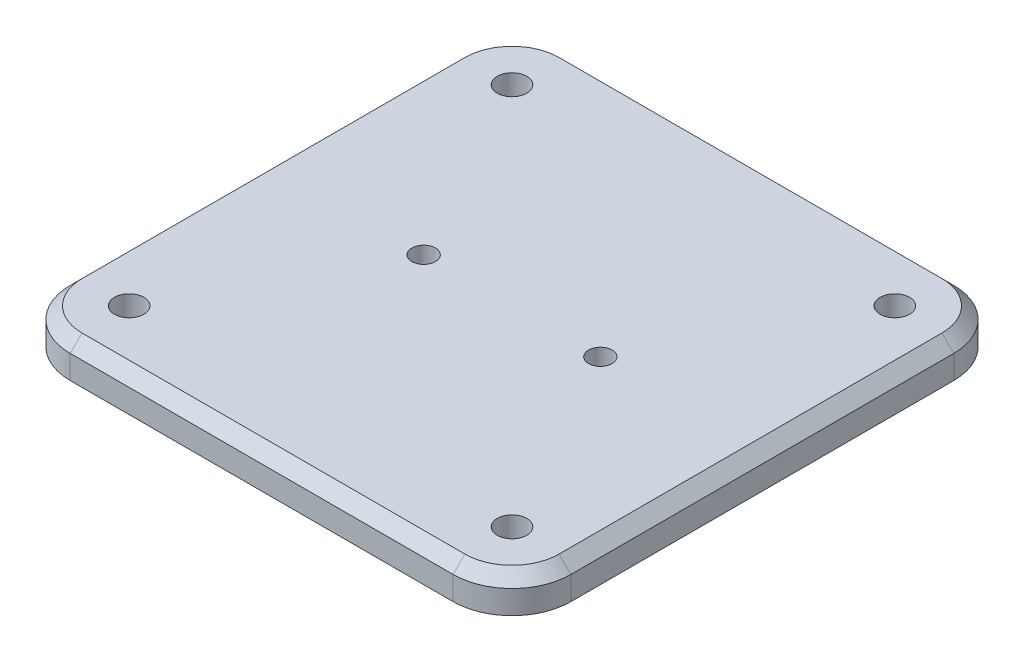
ISO-10303-21;
HEADER;
FILE_DESCRIPTION(('STEP AP214'),'2;1');
FILE_NAME('part.step','',(''),(''),'','','');
FILE_SCHEMA(('AUTOMOTIVE_DESIGN { 1 0 10303 214 1 1 1 1 }'));
ENDSEC;
DATA;
#1=APPLICATION_CONTEXT('core data for automotive mechanical design processes');
#2=APPLICATION_PROTOCOL_DEFINITION('international standard','automotive_design',2000,#1);
#3=PRODUCT_CONTEXT('',#1,'mechanical');
#4=PRODUCT('Part','Part','',(#3));
#5=PRODUCT_RELATED_PRODUCT_CATEGORY('part','',(#4));
#6=PRODUCT_DEFINITION_FORMATION('','',#4);
#7=PRODUCT_DEFINITION_CONTEXT('part definition',#1,'design');
#8=PRODUCT_DEFINITION('design','',#6,#7);
#9=PRODUCT_DEFINITION_SHAPE('','',#8);
#10=(LENGTH_UNIT() NAMED_UNIT(*) SI_UNIT(.MILLI.,.METRE.));
#11=(NAMED_UNIT(*) PLANE_ANGLE_UNIT() SI_UNIT($,.RADIAN.));
#12=(NAMED_UNIT(*) SI_UNIT($,.STERADIAN.) SOLID_ANGLE_UNIT());
#13=UNCERTAINTY_MEASURE_WITH_UNIT(LENGTH_MEASURE(1.E-05),#10,'distance_accuracy_value','');
#14=(GEOMETRIC_REPRESENTATION_CONTEXT(3) GLOBAL_UNCERTAINTY_ASSIGNED_CONTEXT((#13)) GLOBAL_UNIT_ASSIGNED_CONTEXT((#10,
#11,#12)) REPRESENTATION_CONTEXT('',''));
#15=CARTESIAN_POINT('',(0.,0.,0.));
#16=DIRECTION('',(0.,0.,1.));
#17=DIRECTION('',(1.,0.,0.));
#18=AXIS2_PLACEMENT_3D('',#15,#16,#17);
#19=CARTESIAN_POINT('',(-32.5,6.,32.5));
#20=DIRECTION('',(0.,-1.,0.));
#21=DIRECTION('',(0.,0.,-1.));
#22=AXIS2_PLACEMENT_3D('',#19,#20,#21);
#23=PLANE('',#22);
#24=CARTESIAN_POINT('',(-15.,6.,0.));
#25=DIRECTION('',(0.,1.,0.));
#26=DIRECTION('',(0.,0.,1.));
#27=AXIS2_PLACEMENT_3D('',#24,#25,#26);
#28=CIRCLE('',#27,2.);
#29=CARTESIAN_POINT('',(-15.,6.,2.));
#30=VERTEX_POINT('',#29);
#31=EDGE_CURVE('E439',#30,#30,#28,.T.);
#32=ORIENTED_EDGE('',*,*,#31,.F.);
#33=EDGE_LOOP('',(#32));
#34=FACE_BOUND('',#33,.T.);
#35=CARTESIAN_POINT('',(15.,6.,0.));
#36=DIRECTION('',(0.,1.,0.));
#37=DIRECTION('',(0.,0.,1.));
#38=AXIS2_PLACEMENT_3D('',#35,#36,#37);
#39=CIRCLE('',#38,2.);
#40=CARTESIAN_POINT('',(15.,6.,2.));
#41=VERTEX_POINT('',#40);
#42=EDGE_CURVE('E445',#41,#41,#39,.T.);
#43=ORIENTED_EDGE('',*,*,#42,.F.);
#44=EDGE_LOOP('',(#43));
#45=FACE_BOUND('',#44,.T.);
#46=DIRECTION('',(-1.,0.,0.));
#47=VECTOR('',#46,1.);
#48=CARTESIAN_POINT('',(-32.5,6.,-40.5));
#49=LINE('',#48,#47);
#50=CARTESIAN_POINT('',(32.4999999999999,6.,-40.5));
#51=VERTEX_POINT('',#50);
#52=CARTESIAN_POINT('',(-32.4999999999999,6.,-40.5));
#53=VERTEX_POINT('',#52);
#54=EDGE_CURVE('E206',#51,#53,#49,.T.);
#55=ORIENTED_EDGE('',*,*,#54,.T.);
#56=CARTESIAN_POINT('',(-32.5,6.,-32.5));
#57=DIRECTION('',(0.,-1.,0.));
#58=DIRECTION('',(0.,0.,-1.));
#59=AXIS2_PLACEMENT_3D('',#56,#57,#58);
#60=CIRCLE('',#59,7.99999999999998);
#61=CARTESIAN_POINT('',(-40.5,6.,-32.4999999999999));
#62=VERTEX_POINT('',#61);
#63=EDGE_CURVE('E208',#53,#62,#60,.F.);
#64=ORIENTED_EDGE('',*,*,#63,.T.);
#65=DIRECTION('',(0.,0.,1.));
#66=VECTOR('',#65,1.);
#67=CARTESIAN_POINT('',(-40.5,6.,32.5));
#68=LINE('',#67,#66);
#69=CARTESIAN_POINT('',(-40.5,6.,32.4999999999999));
#70=VERTEX_POINT('',#69);
#71=EDGE_CURVE('E144',#62,#70,#68,.T.);
#72=ORIENTED_EDGE('',*,*,#71,.T.);
#73=CARTESIAN_POINT('',(-32.5,6.,32.5));
#74=DIRECTION('',(0.,-1.,0.));
#75=DIRECTION('',(0.,0.,-1.));
#76=AXIS2_PLACEMENT_3D('',#73,#74,#75);
#77=CIRCLE('',#76,7.99999999999998);
#78=CARTESIAN_POINT('',(-32.4999999999999,6.,40.5));
#79=VERTEX_POINT('',#78);
#80=EDGE_CURVE('E198',#70,#79,#77,.F.);
#81=ORIENTED_EDGE('',*,*,#80,.T.);
#82=DIRECTION('',(1.,0.,0.));
#83=VECTOR('',#82,1.);
#84=CARTESIAN_POINT('',(-32.5,6.,40.5));
#85=LINE('',#84,#83);
#86=CARTESIAN_POINT('',(32.5,6.,40.5));
#87=VERTEX_POINT('',#86);
#88=EDGE_CURVE('E196',#79,#87,#85,.T.);
#89=ORIENTED_EDGE('',*,*,#88,.T.);
#90=CARTESIAN_POINT('',(32.5,6.,32.5));
#91=DIRECTION('',(0.,-1.,0.));
#92=DIRECTION('',(0.,0.,-1.));
#93=AXIS2_PLACEMENT_3D('',#90,#91,#92);
#94=CIRCLE('',#93,7.99999999999998);
#95=CARTESIAN_POINT('',(40.5,6.,32.4999999999999));
#96=VERTEX_POINT('',#95);
#97=EDGE_CURVE('E199',#87,#96,#94,.F.);
#98=ORIENTED_EDGE('',*,*,#97,.T.);
#99=DIRECTION('',(0.,0.,-1.));
#100=VECTOR('',#99,1.);
#101=CARTESIAN_POINT('',(40.5,6.,32.5));
#102=LINE('',#101,#100);
#103=CARTESIAN_POINT('',(40.5,6.,-32.5));
#104=VERTEX_POINT('',#103);
#105=EDGE_CURVE('E205',#96,#104,#102,.T.);
#106=ORIENTED_EDGE('',*,*,#105,.T.);
#107=CARTESIAN_POINT('',(32.5,6.,-32.5));
#108=DIRECTION('',(0.,-1.,0.));
#109=DIRECTION('',(0.,0.,-1.));
#110=AXIS2_PLACEMENT_3D('',#107,#108,#109);
#111=CIRCLE('',#110,7.99999999999998);
#112=EDGE_CURVE('E204',#104,#51,#111,.F.);
#113=ORIENTED_EDGE('',*,*,#112,.T.);
#114=EDGE_LOOP('',(#55,#64,#72,#81,#89,#98,#106,#113));
#115=FACE_BOUND('',#114,.T.);
#116=CARTESIAN_POINT('',(-32.5,6.,-32.5));
#117=DIRECTION('',(0.,1.,0.));
#118=DIRECTION('',(0.,0.,1.));
#119=AXIS2_PLACEMENT_3D('',#116,#117,#118);
#120=CIRCLE('',#119,2.5);
#121=CARTESIAN_POINT('',(-32.5,6.,-30.));
#122=VERTEX_POINT('',#121);
#123=EDGE_CURVE('E161',#122,#122,#120,.T.);
#124=ORIENTED_EDGE('',*,*,#123,.F.);
#125=EDGE_LOOP('',(#124));
#126=FACE_BOUND('',#125,.T.);
#127=CARTESIAN_POINT('',(32.5,6.,-32.5));
#128=DIRECTION('',(0.,1.,0.));
#129=DIRECTION('',(0.,0.,-1.));
#130=AXIS2_PLACEMENT_3D('',#127,#128,#129);
#131=CIRCLE('',#130,2.50000000000001);
#132=CARTESIAN_POINT('',(32.5,6.,-35.));
#133=VERTEX_POINT('',#132);
#134=EDGE_CURVE('E264',#133,#133,#131,.T.);
#135=ORIENTED_EDGE('',*,*,#134,.F.);
#136=EDGE_LOOP('',(#135));
#137=FACE_BOUND('',#136,.T.);
#138=CARTESIAN_POINT('',(32.5,6.,32.5));
#139=DIRECTION('',(0.,1.,0.));
#140=DIRECTION('',(0.,0.,1.));
#141=AXIS2_PLACEMENT_3D('',#138,#139,#140);
#142=CIRCLE('',#141,2.50000000000002);
#143=CARTESIAN_POINT('',(32.5,6.,35.));
#144=VERTEX_POINT('',#143);
#145=EDGE_CURVE('E259',#144,#144,#142,.T.);
#146=ORIENTED_EDGE('',*,*,#145,.F.);
#147=EDGE_LOOP('',(#146));
#148=FACE_BOUND('',#147,.T.);
#149=CARTESIAN_POINT('',(-32.5,6.,32.5));
#150=DIRECTION('',(0.,1.,0.));
#151=DIRECTION('',(0.,0.,-1.));
#152=AXIS2_PLACEMENT_3D('',#149,#150,#151);
#153=CIRCLE('',#152,2.5);
#154=CARTESIAN_POINT('',(-32.5,6.,30.));
#155=VERTEX_POINT('',#154);
#156=EDGE_CURVE('E247',#155,#155,#153,.T.);
#157=ORIENTED_EDGE('',*,*,#156,.F.);
#158=EDGE_LOOP('',(#157));
#159=FACE_BOUND('',#158,.T.);
#160=ADVANCED_FACE('F47',(#34,#45,#115,#126,#137,#148,#159),#23,.F.);
#161=CARTESIAN_POINT('',(-32.5,0.,32.5));
#162=DIRECTION('',(0.,-1.,0.));
#163=DIRECTION('',(0.,0.,-1.));
#164=AXIS2_PLACEMENT_3D('',#161,#162,#163);
#165=PLANE('',#164);
#166=CARTESIAN_POINT('',(-15.,0.,0.));
#167=DIRECTION('',(0.,-1.,0.));
#168=DIRECTION('',(0.,0.,-1.));
#169=AXIS2_PLACEMENT_3D('',#166,#167,#168);
#170=CIRCLE('',#169,2.);
#171=CARTESIAN_POINT('',(-15.,0.,-2.));
#172=VERTEX_POINT('',#171);
#173=EDGE_CURVE('E437',#172,#172,#170,.T.);
#174=ORIENTED_EDGE('',*,*,#173,.F.);
#175=EDGE_LOOP('',(#174));
#176=FACE_BOUND('',#175,.T.);
#177=CARTESIAN_POINT('',(15.,0.,0.));
#178=DIRECTION('',(0.,-1.,0.));
#179=DIRECTION('',(0.,0.,-1.));
#180=AXIS2_PLACEMENT_3D('',#177,#178,#179);
#181=CIRCLE('',#180,2.);
#182=CARTESIAN_POINT('',(15.,0.,-2.));
#183=VERTEX_POINT('',#182);
#184=EDGE_CURVE('E53',#183,#183,#181,.T.);
#185=ORIENTED_EDGE('',*,*,#184,.F.);
#186=EDGE_LOOP('',(#185));
#187=FACE_BOUND('',#186,.T.);
#188=CARTESIAN_POINT('',(32.5,0.,32.5));
#189=DIRECTION('',(0.,1.,0.));
#190=DIRECTION('',(0.,0.,1.));
#191=AXIS2_PLACEMENT_3D('',#188,#189,#190);
#192=CIRCLE('',#191,2.50000000000002);
#193=CARTESIAN_POINT('',(32.5,0.,35.));
#194=VERTEX_POINT('',#193);
#195=EDGE_CURVE('E254',#194,#194,#192,.T.);
#196=ORIENTED_EDGE('',*,*,#195,.T.);
#197=EDGE_LOOP('',(#196));
#198=FACE_BOUND('',#197,.T.);
#199=CARTESIAN_POINT('',(-32.5,0.,-32.5));
#200=DIRECTION('',(0.,1.,0.));
#201=DIRECTION('',(0.,0.,1.));
#202=AXIS2_PLACEMENT_3D('',#199,#200,#201);
#203=CIRCLE('',#202,2.5);
#204=CARTESIAN_POINT('',(-32.5,0.,-30.));
#205=VERTEX_POINT('',#204);
#206=EDGE_CURVE('E163',#205,#205,#203,.T.);
#207=ORIENTED_EDGE('',*,*,#206,.T.);
#208=EDGE_LOOP('',(#207));
#209=FACE_BOUND('',#208,.T.);
#210=CARTESIAN_POINT('',(-32.5,0.,32.5));
#211=DIRECTION('',(0.,1.,0.));
#212=DIRECTION('',(0.,0.,-1.));
#213=AXIS2_PLACEMENT_3D('',#210,#211,#212);
#214=CIRCLE('',#213,9.99999999999999);
#215=CARTESIAN_POINT('',(-42.5,0.,32.4999999999999));
#216=VERTEX_POINT('',#215);
#217=CARTESIAN_POINT('',(-32.4999999999999,0.,42.5));
#218=VERTEX_POINT('',#217);
#219=EDGE_CURVE('E153',#216,#218,#214,.T.);
#220=ORIENTED_EDGE('',*,*,#219,.F.);
#221=DIRECTION('',(0.,0.,1.));
#222=VECTOR('',#221,1.);
#223=CARTESIAN_POINT('',(-42.5,0.,32.4999999999999));
#224=LINE('',#223,#222);
#225=CARTESIAN_POINT('',(-42.5,0.,-32.4999999999999));
#226=VERTEX_POINT('',#225);
#227=EDGE_CURVE('E182',#226,#216,#224,.T.);
#228=ORIENTED_EDGE('',*,*,#227,.F.);
#229=CARTESIAN_POINT('',(-32.5,0.,-32.5));
#230=DIRECTION('',(0.,1.,0.));
#231=DIRECTION('',(0.,0.,-1.));
#232=AXIS2_PLACEMENT_3D('',#229,#230,#231);
#233=CIRCLE('',#232,9.99999999999999);
#234=CARTESIAN_POINT('',(-32.4999999999999,0.,-42.5));
#235=VERTEX_POINT('',#234);
#236=EDGE_CURVE('E176',#235,#226,#233,.T.);
#237=ORIENTED_EDGE('',*,*,#236,.F.);
#238=DIRECTION('',(-1.,0.,0.));
#239=VECTOR('',#238,1.);
#240=CARTESIAN_POINT('',(-32.4999999999999,0.,-42.5));
#241=LINE('',#240,#239);
#242=CARTESIAN_POINT('',(32.4999999999999,0.,-42.5));
#243=VERTEX_POINT('',#242);
#244=EDGE_CURVE('E173',#243,#235,#241,.T.);
#245=ORIENTED_EDGE('',*,*,#244,.F.);
#246=CARTESIAN_POINT('',(32.5,0.,-32.5));
#247=DIRECTION('',(0.,1.,0.));
#248=DIRECTION('',(0.,0.,-1.));
#249=AXIS2_PLACEMENT_3D('',#246,#247,#248);
#250=CIRCLE('',#249,9.99999999999999);
#251=CARTESIAN_POINT('',(42.5,0.,-32.4999999999999));
#252=VERTEX_POINT('',#251);
#253=EDGE_CURVE('E175',#252,#243,#250,.T.);
#254=ORIENTED_EDGE('',*,*,#253,.F.);
#255=DIRECTION('',(0.,0.,-1.));
#256=VECTOR('',#255,1.);
#257=CARTESIAN_POINT('',(42.5,0.,32.4999999999999));
#258=LINE('',#257,#256);
#259=CARTESIAN_POINT('',(42.5,0.,32.4999999999999));
#260=VERTEX_POINT('',#259);
#261=EDGE_CURVE('E166',#260,#252,#258,.T.);
#262=ORIENTED_EDGE('',*,*,#261,.F.);
#263=CARTESIAN_POINT('',(32.5,0.,32.5));
#264=DIRECTION('',(0.,1.,0.));
#265=DIRECTION('',(0.,0.,1.));
#266=AXIS2_PLACEMENT_3D('',#263,#264,#265);
#267=CIRCLE('',#266,9.99999999999999);
#268=CARTESIAN_POINT('',(32.4999999999999,0.,42.5));
#269=VERTEX_POINT('',#268);
#270=EDGE_CURVE('E156',#269,#260,#267,.T.);
#271=ORIENTED_EDGE('',*,*,#270,.F.);
#272=DIRECTION('',(1.,0.,0.));
#273=VECTOR('',#272,1.);
#274=CARTESIAN_POINT('',(-32.4999999999999,0.,42.5));
#275=LINE('',#274,#273);
#276=EDGE_CURVE('E143',#218,#269,#275,.T.);
#277=ORIENTED_EDGE('',*,*,#276,.F.);
#278=EDGE_LOOP('',(#220,#228,#237,#245,#254,#262,#271,#277));
#279=FACE_BOUND('',#278,.T.);
#280=CARTESIAN_POINT('',(32.5,0.,-32.5));
#281=DIRECTION('',(0.,1.,0.));
#282=DIRECTION('',(0.,0.,-1.));
#283=AXIS2_PLACEMENT_3D('',#280,#281,#282);
#284=CIRCLE('',#283,2.50000000000001);
#285=CARTESIAN_POINT('',(32.5,0.,-35.));
#286=VERTEX_POINT('',#285);
#287=EDGE_CURVE('E265',#286,#286,#284,.T.);
#288=ORIENTED_EDGE('',*,*,#287,.T.);
#289=EDGE_LOOP('',(#288));
#290=FACE_BOUND('',#289,.T.);
#291=CARTESIAN_POINT('',(-32.5,0.,32.5));
#292=DIRECTION('',(0.,1.,0.));
#293=DIRECTION('',(0.,0.,-1.));
#294=AXIS2_PLACEMENT_3D('',#291,#292,#293);
#295=CIRCLE('',#294,2.5);
#296=CARTESIAN_POINT('',(-32.5,0.,30.));
#297=VERTEX_POINT('',#296);
#298=EDGE_CURVE('E241',#297,#297,#295,.T.);
#299=ORIENTED_EDGE('',*,*,#298,.T.);
#300=EDGE_LOOP('',(#299));
#301=FACE_BOUND('',#300,.T.);
#302=ADVANCED_FACE('F147',(#176,#187,#198,#209,#279,#290,#301),#165,.T.);
#303=CARTESIAN_POINT('',(-32.5,6.,32.5));
#304=DIRECTION('',(0.,-1.,0.));
#305=DIRECTION('',(0.,0.,-1.));
#306=AXIS2_PLACEMENT_3D('',#303,#304,#305);
#307=CYLINDRICAL_SURFACE('',#306,9.99999999999999);
#308=DIRECTION('',(0.,-1.,0.));
#309=VECTOR('',#308,1.);
#310=CARTESIAN_POINT('',(-32.4999999999999,6.,42.5));
#311=LINE('',#310,#309);
#312=CARTESIAN_POINT('',(-32.4999999999999,3.99999999999997,42.5));
#313=VERTEX_POINT('',#312);
#314=EDGE_CURVE('E136',#313,#218,#311,.T.);
#315=ORIENTED_EDGE('',*,*,#314,.F.);
#316=CARTESIAN_POINT('',(-32.5,3.99999999999997,32.5));
#317=DIRECTION('',(0.,-1.,0.));
#318=DIRECTION('',(0.,0.,-1.));
#319=AXIS2_PLACEMENT_3D('',#316,#317,#318);
#320=CIRCLE('',#319,9.99999999999999);
#321=CARTESIAN_POINT('',(-42.5,3.99999999999997,32.4999999999999));
#322=VERTEX_POINT('',#321);
#323=EDGE_CURVE('E56',#313,#322,#320,.T.);
#324=ORIENTED_EDGE('',*,*,#323,.T.);
#325=DIRECTION('',(0.,-1.,0.));
#326=VECTOR('',#325,1.);
#327=CARTESIAN_POINT('',(-42.5,6.,32.4999999999999));
#328=LINE('',#327,#326);
#329=EDGE_CURVE('E157',#322,#216,#328,.T.);
#330=ORIENTED_EDGE('',*,*,#329,.T.);
#331=ORIENTED_EDGE('',*,*,#219,.T.);
#332=EDGE_LOOP('',(#315,#324,#330,#331));
#333=FACE_BOUND('',#332,.T.);
#334=ADVANCED_FACE('F158',(#333),#307,.T.);
#335=CARTESIAN_POINT('',(-32.4999999999999,6.,42.5));
#336=DIRECTION('',(0.,0.,-1.));
#337=DIRECTION('',(-1.,0.,0.));
#338=AXIS2_PLACEMENT_3D('',#335,#336,#337);
#339=PLANE('',#338);
#340=DIRECTION('',(0.,-1.,0.));
#341=VECTOR('',#340,1.);
#342=CARTESIAN_POINT('',(32.4999999999999,6.,42.5));
#343=LINE('',#342,#341);
#344=CARTESIAN_POINT('',(32.4999999999999,3.99999999999997,42.5));
#345=VERTEX_POINT('',#344);
#346=EDGE_CURVE('E148',#345,#269,#343,.T.);
#347=ORIENTED_EDGE('',*,*,#346,.F.);
#348=DIRECTION('',(-1.,0.,0.));
#349=VECTOR('',#348,1.);
#350=CARTESIAN_POINT('',(-32.4999999999999,3.99999999999997,42.5));
#351=LINE('',#350,#349);
#352=EDGE_CURVE('E74',#345,#313,#351,.T.);
#353=ORIENTED_EDGE('',*,*,#352,.T.);
#354=ORIENTED_EDGE('',*,*,#314,.T.);
#355=ORIENTED_EDGE('',*,*,#276,.T.);
#356=EDGE_LOOP('',(#347,#353,#354,#355));
#357=FACE_BOUND('',#356,.T.);
#358=ADVANCED_FACE('F137',(#357),#339,.F.);
#359=CARTESIAN_POINT('',(32.5,6.,32.5));
#360=DIRECTION('',(0.,-1.,0.));
#361=DIRECTION('',(0.,0.,-1.));
#362=AXIS2_PLACEMENT_3D('',#359,#360,#361);
#363=CYLINDRICAL_SURFACE('',#362,9.99999999999999);
#364=DIRECTION('',(0.,-1.,0.));
#365=VECTOR('',#364,1.);
#366=CARTESIAN_POINT('',(42.5,6.,32.4999999999999));
#367=LINE('',#366,#365);
#368=CARTESIAN_POINT('',(42.5,3.99999999999997,32.4999999999999));
#369=VERTEX_POINT('',#368);
#370=EDGE_CURVE('E195',#369,#260,#367,.T.);
#371=ORIENTED_EDGE('',*,*,#370,.F.);
#372=CARTESIAN_POINT('',(32.5,3.99999999999997,32.5));
#373=DIRECTION('',(0.,-1.,0.));
#374=DIRECTION('',(0.,0.,-1.));
#375=AXIS2_PLACEMENT_3D('',#372,#373,#374);
#376=CIRCLE('',#375,9.99999999999999);
#377=EDGE_CURVE('E219',#369,#345,#376,.T.);
#378=ORIENTED_EDGE('',*,*,#377,.T.);
#379=ORIENTED_EDGE('',*,*,#346,.T.);
#380=ORIENTED_EDGE('',*,*,#270,.T.);
#381=EDGE_LOOP('',(#371,#378,#379,#380));
#382=FACE_BOUND('',#381,.T.);
#383=ADVANCED_FACE('F320',(#382),#363,.T.);
#384=CARTESIAN_POINT('',(42.5,6.,32.4999999999999));
#385=DIRECTION('',(-1.,0.,0.));
#386=DIRECTION('',(0.,0.,1.));
#387=AXIS2_PLACEMENT_3D('',#384,#385,#386);
#388=PLANE('',#387);
#389=DIRECTION('',(0.,-1.,0.));
#390=VECTOR('',#389,1.);
#391=CARTESIAN_POINT('',(42.5,6.,-32.4999999999999));
#392=LINE('',#391,#390);
#393=CARTESIAN_POINT('',(42.5,3.99999999999997,-32.4999999999999));
#394=VERTEX_POINT('',#393);
#395=EDGE_CURVE('E188',#394,#252,#392,.T.);
#396=ORIENTED_EDGE('',*,*,#395,.F.);
#397=DIRECTION('',(0.,0.,1.));
#398=VECTOR('',#397,1.);
#399=CARTESIAN_POINT('',(42.5,3.99999999999997,32.4999999999999));
#400=LINE('',#399,#398);
#401=EDGE_CURVE('E217',#394,#369,#400,.T.);
#402=ORIENTED_EDGE('',*,*,#401,.T.);
#403=ORIENTED_EDGE('',*,*,#370,.T.);
#404=ORIENTED_EDGE('',*,*,#261,.T.);
#405=EDGE_LOOP('',(#396,#402,#403,#404));
#406=FACE_BOUND('',#405,.T.);
#407=ADVANCED_FACE('F311',(#406),#388,.F.);
#408=CARTESIAN_POINT('',(32.5,6.,-32.5));
#409=DIRECTION('',(0.,-1.,0.));
#410=DIRECTION('',(0.,0.,-1.));
#411=AXIS2_PLACEMENT_3D('',#408,#409,#410);
#412=CYLINDRICAL_SURFACE('',#411,9.99999999999999);
#413=DIRECTION('',(0.,-1.,0.));
#414=VECTOR('',#413,1.);
#415=CARTESIAN_POINT('',(32.4999999999999,6.,-42.5));
#416=LINE('',#415,#414);
#417=CARTESIAN_POINT('',(32.4999999999999,3.99999999999997,-42.5));
#418=VERTEX_POINT('',#417);
#419=EDGE_CURVE('E189',#418,#243,#416,.T.);
#420=ORIENTED_EDGE('',*,*,#419,.F.);
#421=CARTESIAN_POINT('',(32.5,3.99999999999997,-32.5));
#422=DIRECTION('',(0.,-1.,0.));
#423=DIRECTION('',(0.,0.,-1.));
#424=AXIS2_PLACEMENT_3D('',#421,#422,#423);
#425=CIRCLE('',#424,9.99999999999999);
#426=EDGE_CURVE('E216',#418,#394,#425,.T.);
#427=ORIENTED_EDGE('',*,*,#426,.T.);
#428=ORIENTED_EDGE('',*,*,#395,.T.);
#429=ORIENTED_EDGE('',*,*,#253,.T.);
#430=EDGE_LOOP('',(#420,#427,#428,#429));
#431=FACE_BOUND('',#430,.T.);
#432=ADVANCED_FACE('F310',(#431),#412,.T.);
#433=CARTESIAN_POINT('',(-32.4999999999999,6.,-42.5));
#434=DIRECTION('',(0.,0.,1.));
#435=DIRECTION('',(1.,0.,0.));
#436=AXIS2_PLACEMENT_3D('',#433,#434,#435);
#437=PLANE('',#436);
#438=DIRECTION('',(0.,-1.,0.));
#439=VECTOR('',#438,1.);
#440=CARTESIAN_POINT('',(-32.4999999999999,6.,-42.5));
#441=LINE('',#440,#439);
#442=CARTESIAN_POINT('',(-32.4999999999999,3.99999999999997,-42.5));
#443=VERTEX_POINT('',#442);
#444=EDGE_CURVE('E187',#443,#235,#441,.T.);
#445=ORIENTED_EDGE('',*,*,#444,.F.);
#446=DIRECTION('',(1.,0.,0.));
#447=VECTOR('',#446,1.);
#448=CARTESIAN_POINT('',(-32.4999999999999,3.99999999999997,-42.5));
#449=LINE('',#448,#447);
#450=EDGE_CURVE('E212',#443,#418,#449,.T.);
#451=ORIENTED_EDGE('',*,*,#450,.T.);
#452=ORIENTED_EDGE('',*,*,#419,.T.);
#453=ORIENTED_EDGE('',*,*,#244,.T.);
#454=EDGE_LOOP('',(#445,#451,#452,#453));
#455=FACE_BOUND('',#454,.T.);
#456=ADVANCED_FACE('F302',(#455),#437,.F.);
#457=CARTESIAN_POINT('',(-32.5,6.,-32.5));
#458=DIRECTION('',(0.,-1.,0.));
#459=DIRECTION('',(0.,0.,-1.));
#460=AXIS2_PLACEMENT_3D('',#457,#458,#459);
#461=CYLINDRICAL_SURFACE('',#460,9.99999999999999);
#462=DIRECTION('',(0.,-1.,0.));
#463=VECTOR('',#462,1.);
#464=CARTESIAN_POINT('',(-42.5,6.,-32.4999999999999));
#465=LINE('',#464,#463);
#466=CARTESIAN_POINT('',(-42.5,3.99999999999997,-32.4999999999999));
#467=VERTEX_POINT('',#466);
#468=EDGE_CURVE('E184',#467,#226,#465,.T.);
#469=ORIENTED_EDGE('',*,*,#468,.F.);
#470=CARTESIAN_POINT('',(-32.5,3.99999999999997,-32.5));
#471=DIRECTION('',(0.,-1.,0.));
#472=DIRECTION('',(0.,0.,-1.));
#473=AXIS2_PLACEMENT_3D('',#470,#471,#472);
#474=CIRCLE('',#473,9.99999999999999);
#475=EDGE_CURVE('E211',#467,#443,#474,.T.);
#476=ORIENTED_EDGE('',*,*,#475,.T.);
#477=ORIENTED_EDGE('',*,*,#444,.T.);
#478=ORIENTED_EDGE('',*,*,#236,.T.);
#479=EDGE_LOOP('',(#469,#476,#477,#478));
#480=FACE_BOUND('',#479,.T.);
#481=ADVANCED_FACE('F303',(#480),#461,.T.);
#482=CARTESIAN_POINT('',(-42.5,6.,32.4999999999999));
#483=DIRECTION('',(1.,0.,0.));
#484=DIRECTION('',(0.,0.,-1.));
#485=AXIS2_PLACEMENT_3D('',#482,#483,#484);
#486=PLANE('',#485);
#487=ORIENTED_EDGE('',*,*,#329,.F.);
#488=DIRECTION('',(0.,0.,-1.));
#489=VECTOR('',#488,1.);
#490=CARTESIAN_POINT('',(-42.5,3.99999999999997,32.4999999999999));
#491=LINE('',#490,#489);
#492=EDGE_CURVE('E11',#322,#467,#491,.T.);
#493=ORIENTED_EDGE('',*,*,#492,.T.);
#494=ORIENTED_EDGE('',*,*,#468,.T.);
#495=ORIENTED_EDGE('',*,*,#227,.T.);
#496=EDGE_LOOP('',(#487,#493,#494,#495));
#497=FACE_BOUND('',#496,.T.);
#498=ADVANCED_FACE('F281',(#497),#486,.F.);
#499=CARTESIAN_POINT('',(-32.5,6.,-32.5));
#500=DIRECTION('',(0.,-1.,0.));
#501=DIRECTION('',(0.,0.,-1.));
#502=AXIS2_PLACEMENT_3D('',#499,#500,#501);
#503=CYLINDRICAL_SURFACE('',#502,2.5);
#504=ORIENTED_EDGE('',*,*,#123,.T.);
#505=EDGE_LOOP('',(#504));
#506=FACE_BOUND('',#505,.T.);
#507=ORIENTED_EDGE('',*,*,#206,.F.);
#508=EDGE_LOOP('',(#507));
#509=FACE_BOUND('',#508,.T.);
#510=ADVANCED_FACE('F273',(#506,#509),#503,.F.);
#511=CARTESIAN_POINT('',(32.5,6.,-32.5));
#512=DIRECTION('',(0.,-1.,0.));
#513=DIRECTION('',(0.,0.,-1.));
#514=AXIS2_PLACEMENT_3D('',#511,#512,#513);
#515=CYLINDRICAL_SURFACE('',#514,2.50000000000001);
#516=ORIENTED_EDGE('',*,*,#134,.T.);
#517=EDGE_LOOP('',(#516));
#518=FACE_BOUND('',#517,.T.);
#519=ORIENTED_EDGE('',*,*,#287,.F.);
#520=EDGE_LOOP('',(#519));
#521=FACE_BOUND('',#520,.T.);
#522=ADVANCED_FACE('F271',(#518,#521),#515,.F.);
#523=CARTESIAN_POINT('',(32.5,6.,32.5));
#524=DIRECTION('',(0.,-1.,0.));
#525=DIRECTION('',(0.,0.,-1.));
#526=AXIS2_PLACEMENT_3D('',#523,#524,#525);
#527=CYLINDRICAL_SURFACE('',#526,2.50000000000002);
#528=ORIENTED_EDGE('',*,*,#145,.T.);
#529=EDGE_LOOP('',(#528));
#530=FACE_BOUND('',#529,.T.);
#531=ORIENTED_EDGE('',*,*,#195,.F.);
#532=EDGE_LOOP('',(#531));
#533=FACE_BOUND('',#532,.T.);
#534=ADVANCED_FACE('F272',(#530,#533),#527,.F.);
#535=CARTESIAN_POINT('',(-32.5,6.,32.5));
#536=DIRECTION('',(0.,-1.,0.));
#537=DIRECTION('',(0.,0.,-1.));
#538=AXIS2_PLACEMENT_3D('',#535,#536,#537);
#539=CYLINDRICAL_SURFACE('',#538,2.5);
#540=ORIENTED_EDGE('',*,*,#156,.T.);
#541=EDGE_LOOP('',(#540));
#542=FACE_BOUND('',#541,.T.);
#543=ORIENTED_EDGE('',*,*,#298,.F.);
#544=EDGE_LOOP('',(#543));
#545=FACE_BOUND('',#544,.T.);
#546=ADVANCED_FACE('F282',(#542,#545),#539,.F.);
#547=CARTESIAN_POINT('',(32.5,6.,32.5));
#548=DIRECTION('',(0.,-1.,0.));
#549=DIRECTION('',(0.,0.,-1.));
#550=AXIS2_PLACEMENT_3D('',#547,#548,#549);
#551=CONICAL_SURFACE('',#550,7.99999999999998,0.785398163397445);
#552=DIRECTION('',(0.,0.70710678118655,-0.707106781186545));
#553=VECTOR('',#552,1.);
#554=CARTESIAN_POINT('',(32.4999999999999,3.99999999999997,42.5));
#555=LINE('',#554,#553);
#556=EDGE_CURVE('E238',#345,#87,#555,.T.);
#557=ORIENTED_EDGE('',*,*,#556,.F.);
#558=ORIENTED_EDGE('',*,*,#377,.F.);
#559=DIRECTION('',(0.707106781186545,-0.70710678118655,0.));
#560=VECTOR('',#559,1.);
#561=CARTESIAN_POINT('',(40.5,6.,32.4999999999999));
#562=LINE('',#561,#560);
#563=EDGE_CURVE('E245',#96,#369,#562,.T.);
#564=ORIENTED_EDGE('',*,*,#563,.F.);
#565=ORIENTED_EDGE('',*,*,#97,.F.);
#566=EDGE_LOOP('',(#557,#558,#564,#565));
#567=FACE_BOUND('',#566,.T.);
#568=ADVANCED_FACE('F55',(#567),#551,.T.);
#569=CARTESIAN_POINT('',(40.5,6.,32.5));
#570=DIRECTION('',(-0.70710678118655,-0.707106781186545,0.));
#571=DIRECTION('',(0.,0.,-1.));
#572=AXIS2_PLACEMENT_3D('',#569,#570,#571);
#573=PLANE('',#572);
#574=ORIENTED_EDGE('',*,*,#563,.T.);
#575=ORIENTED_EDGE('',*,*,#401,.F.);
#576=DIRECTION('',(0.707106781186545,-0.70710678118655,0.));
#577=VECTOR('',#576,1.);
#578=CARTESIAN_POINT('',(40.5,6.,-32.5));
#579=LINE('',#578,#577);
#580=EDGE_CURVE('E240',#104,#394,#579,.T.);
#581=ORIENTED_EDGE('',*,*,#580,.F.);
#582=ORIENTED_EDGE('',*,*,#105,.F.);
#583=EDGE_LOOP('',(#574,#575,#581,#582));
#584=FACE_BOUND('',#583,.T.);
#585=ADVANCED_FACE('F370',(#584),#573,.F.);
#586=CARTESIAN_POINT('',(-32.5,6.,40.5));
#587=DIRECTION('',(0.,-0.707106781186545,-0.70710678118655));
#588=DIRECTION('',(1.,0.,0.));
#589=AXIS2_PLACEMENT_3D('',#586,#587,#588);
#590=PLANE('',#589);
#591=ORIENTED_EDGE('',*,*,#556,.T.);
#592=ORIENTED_EDGE('',*,*,#88,.F.);
#593=DIRECTION('',(0.,0.70710678118655,-0.707106781186545));
#594=VECTOR('',#593,1.);
#595=CARTESIAN_POINT('',(-32.4999999999999,3.99999999999997,42.5));
#596=LINE('',#595,#594);
#597=EDGE_CURVE('E234',#313,#79,#596,.T.);
#598=ORIENTED_EDGE('',*,*,#597,.F.);
#599=ORIENTED_EDGE('',*,*,#352,.F.);
#600=EDGE_LOOP('',(#591,#592,#598,#599));
#601=FACE_BOUND('',#600,.T.);
#602=ADVANCED_FACE('F363',(#601),#590,.F.);
#603=CARTESIAN_POINT('',(32.5,6.,-32.5));
#604=DIRECTION('',(0.,-1.,0.));
#605=DIRECTION('',(0.,0.,-1.));
#606=AXIS2_PLACEMENT_3D('',#603,#604,#605);
#607=CONICAL_SURFACE('',#606,7.99999999999998,0.785398163397445);
#608=ORIENTED_EDGE('',*,*,#580,.T.);
#609=ORIENTED_EDGE('',*,*,#426,.F.);
#610=DIRECTION('',(0.,-0.70710678118655,-0.707106781186545));
#611=VECTOR('',#610,1.);
#612=CARTESIAN_POINT('',(32.4999999999999,6.,-40.5));
#613=LINE('',#612,#611);
#614=EDGE_CURVE('E233',#51,#418,#613,.T.);
#615=ORIENTED_EDGE('',*,*,#614,.F.);
#616=ORIENTED_EDGE('',*,*,#112,.F.);
#617=EDGE_LOOP('',(#608,#609,#615,#616));
#618=FACE_BOUND('',#617,.T.);
#619=ADVANCED_FACE('F351',(#618),#607,.T.);
#620=CARTESIAN_POINT('',(-32.5,6.,32.5));
#621=DIRECTION('',(0.,-1.,0.));
#622=DIRECTION('',(0.,0.,-1.));
#623=AXIS2_PLACEMENT_3D('',#620,#621,#622);
#624=CONICAL_SURFACE('',#623,7.99999999999998,0.785398163397445);
#625=ORIENTED_EDGE('',*,*,#597,.T.);
#626=ORIENTED_EDGE('',*,*,#80,.F.);
#627=DIRECTION('',(0.707106781186545,0.70710678118655,0.));
#628=VECTOR('',#627,1.);
#629=CARTESIAN_POINT('',(-42.5,3.99999999999997,32.4999999999999));
#630=LINE('',#629,#628);
#631=EDGE_CURVE('E229',#322,#70,#630,.T.);
#632=ORIENTED_EDGE('',*,*,#631,.F.);
#633=ORIENTED_EDGE('',*,*,#323,.F.);
#634=EDGE_LOOP('',(#625,#626,#632,#633));
#635=FACE_BOUND('',#634,.T.);
#636=ADVANCED_FACE('F350',(#635),#624,.T.);
#637=CARTESIAN_POINT('',(-32.5,6.,-40.5));
#638=DIRECTION('',(0.,-0.707106781186545,0.70710678118655));
#639=DIRECTION('',(-1.,0.,0.));
#640=AXIS2_PLACEMENT_3D('',#637,#638,#639);
#641=PLANE('',#640);
#642=ORIENTED_EDGE('',*,*,#614,.T.);
#643=ORIENTED_EDGE('',*,*,#450,.F.);
#644=DIRECTION('',(0.,-0.70710678118655,-0.707106781186545));
#645=VECTOR('',#644,1.);
#646=CARTESIAN_POINT('',(-32.4999999999999,6.,-40.5));
#647=LINE('',#646,#645);
#648=EDGE_CURVE('E227',#53,#443,#647,.T.);
#649=ORIENTED_EDGE('',*,*,#648,.F.);
#650=ORIENTED_EDGE('',*,*,#54,.F.);
#651=EDGE_LOOP('',(#642,#643,#649,#650));
#652=FACE_BOUND('',#651,.T.);
#653=ADVANCED_FACE('F338',(#652),#641,.F.);
#654=CARTESIAN_POINT('',(-40.5,6.,32.5));
#655=DIRECTION('',(0.70710678118655,-0.707106781186545,0.));
#656=DIRECTION('',(0.,0.,1.));
#657=AXIS2_PLACEMENT_3D('',#654,#655,#656);
#658=PLANE('',#657);
#659=ORIENTED_EDGE('',*,*,#631,.T.);
#660=ORIENTED_EDGE('',*,*,#71,.F.);
#661=DIRECTION('',(0.707106781186545,0.70710678118655,0.));
#662=VECTOR('',#661,1.);
#663=CARTESIAN_POINT('',(-42.5,3.99999999999997,-32.4999999999999));
#664=LINE('',#663,#662);
#665=EDGE_CURVE('E221',#467,#62,#664,.T.);
#666=ORIENTED_EDGE('',*,*,#665,.F.);
#667=ORIENTED_EDGE('',*,*,#492,.F.);
#668=EDGE_LOOP('',(#659,#660,#666,#667));
#669=FACE_BOUND('',#668,.T.);
#670=ADVANCED_FACE('F334',(#669),#658,.F.);
#671=CARTESIAN_POINT('',(-32.5,6.,-32.5));
#672=DIRECTION('',(0.,-1.,0.));
#673=DIRECTION('',(0.,0.,-1.));
#674=AXIS2_PLACEMENT_3D('',#671,#672,#673);
#675=CONICAL_SURFACE('',#674,7.99999999999998,0.785398163397445);
#676=ORIENTED_EDGE('',*,*,#648,.T.);
#677=ORIENTED_EDGE('',*,*,#475,.F.);
#678=ORIENTED_EDGE('',*,*,#665,.T.);
#679=ORIENTED_EDGE('',*,*,#63,.F.);
#680=EDGE_LOOP('',(#676,#677,#678,#679));
#681=FACE_BOUND('',#680,.T.);
#682=ADVANCED_FACE('F326',(#681),#675,.T.);
#683=CARTESIAN_POINT('',(15.,6.,0.));
#684=DIRECTION('',(0.,1.,0.));
#685=DIRECTION('',(0.,0.,1.));
#686=AXIS2_PLACEMENT_3D('',#683,#684,#685);
#687=CYLINDRICAL_SURFACE('',#686,2.);
#688=ORIENTED_EDGE('',*,*,#184,.T.);
#689=EDGE_LOOP('',(#688));
#690=FACE_BOUND('',#689,.T.);
#691=ORIENTED_EDGE('',*,*,#42,.T.);
#692=EDGE_LOOP('',(#691));
#693=FACE_BOUND('',#692,.T.);
#694=ADVANCED_FACE('F335',(#690,#693),#687,.F.);
#695=CARTESIAN_POINT('',(-15.,6.,0.));
#696=DIRECTION('',(0.,1.,0.));
#697=DIRECTION('',(0.,0.,1.));
#698=AXIS2_PLACEMENT_3D('',#695,#696,#697);
#699=CYLINDRICAL_SURFACE('',#698,2.);
#700=ORIENTED_EDGE('',*,*,#173,.T.);
#701=EDGE_LOOP('',(#700));
#702=FACE_BOUND('',#701,.T.);
#703=ORIENTED_EDGE('',*,*,#31,.T.);
#704=EDGE_LOOP('',(#703));
#705=FACE_BOUND('',#704,.T.);
#706=ADVANCED_FACE('F427',(#702,#705),#699,.F.);
#707=CLOSED_SHELL('',(#160,#302,#334,#358,#383,#407,#432,#456,#481,#498,#510,#522,#534,#546,
#568,#585,#602,#619,#636,#653,#670,#682,#694,#706));
#708=MANIFOLD_SOLID_BREP('B2',#707);
#709=ADVANCED_BREP_SHAPE_REPRESENTATION('',(#18,#708),#14);
#710=SHAPE_DEFINITION_REPRESENTATION(#9,#709);
ENDSEC;
END-ISO-10303-21;
